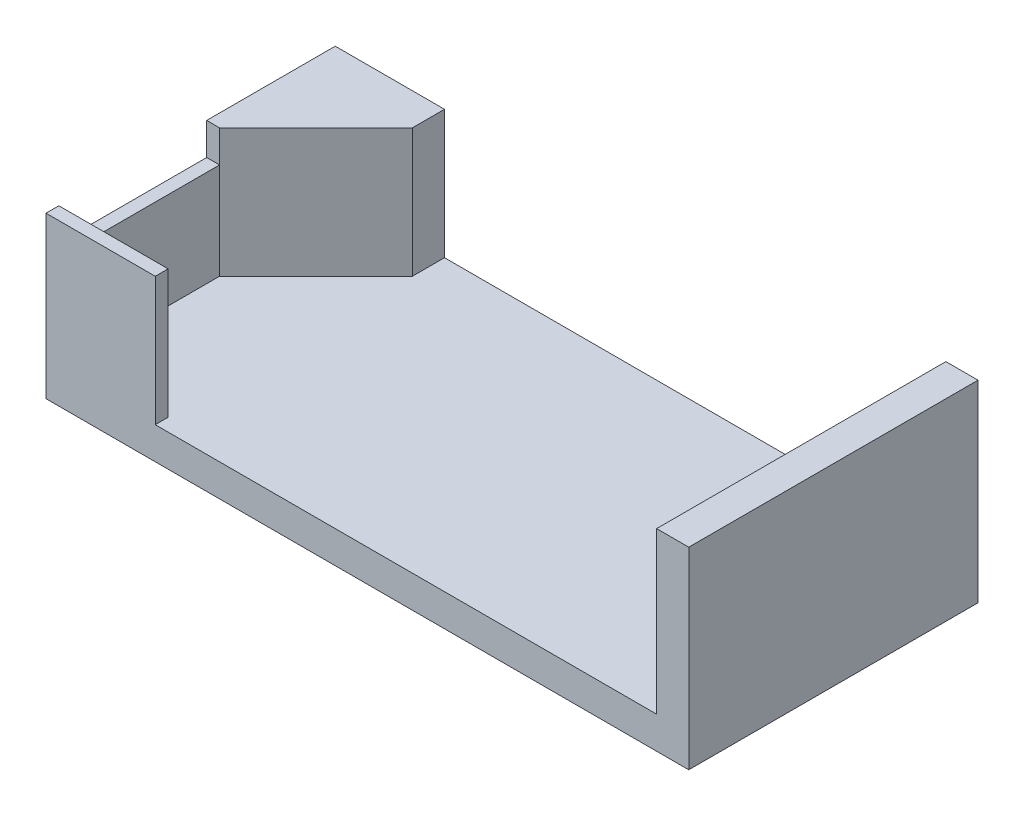
ISO-10303-21;
HEADER;
FILE_DESCRIPTION(('STEP AP214'),'2;1');
FILE_NAME('part.step','',(''),(''),'','','');
FILE_SCHEMA(('AUTOMOTIVE_DESIGN { 1 0 10303 214 1 1 1 1 }'));
ENDSEC;
DATA;
#1=APPLICATION_CONTEXT('core data for automotive mechanical design processes');
#2=APPLICATION_PROTOCOL_DEFINITION('international standard','automotive_design',2000,#1);
#3=PRODUCT_CONTEXT('',#1,'mechanical');
#4=PRODUCT('Part','Part','',(#3));
#5=PRODUCT_RELATED_PRODUCT_CATEGORY('part','',(#4));
#6=PRODUCT_DEFINITION_FORMATION('','',#4);
#7=PRODUCT_DEFINITION_CONTEXT('part definition',#1,'design');
#8=PRODUCT_DEFINITION('design','',#6,#7);
#9=PRODUCT_DEFINITION_SHAPE('','',#8);
#10=(LENGTH_UNIT() NAMED_UNIT(*) SI_UNIT(.MILLI.,.METRE.));
#11=(NAMED_UNIT(*) PLANE_ANGLE_UNIT() SI_UNIT($,.RADIAN.));
#12=(NAMED_UNIT(*) SI_UNIT($,.STERADIAN.) SOLID_ANGLE_UNIT());
#13=UNCERTAINTY_MEASURE_WITH_UNIT(LENGTH_MEASURE(1.E-05),#10,'distance_accuracy_value','');
#14=(GEOMETRIC_REPRESENTATION_CONTEXT(3) GLOBAL_UNCERTAINTY_ASSIGNED_CONTEXT((#13)) GLOBAL_UNIT_ASSIGNED_CONTEXT((#10,
#11,#12)) REPRESENTATION_CONTEXT('',''));
#15=CARTESIAN_POINT('',(0.,0.,0.));
#16=DIRECTION('',(0.,0.,1.));
#17=DIRECTION('',(1.,0.,0.));
#18=AXIS2_PLACEMENT_3D('',#15,#16,#17);
#19=CARTESIAN_POINT('',(0.,0.,0.));
#20=DIRECTION('',(0.,1.,0.));
#21=DIRECTION('',(0.,0.,1.));
#22=AXIS2_PLACEMENT_3D('',#19,#20,#21);
#23=PLANE('',#22);
#24=DIRECTION('',(0.707106781186549,0.,-0.707106781186546));
#25=VECTOR('',#24,1.);
#26=CARTESIAN_POINT('',(-25.25,0.,-25.25));
#27=LINE('',#26,#25);
#28=CARTESIAN_POINT('',(-48.,0.,-2.50000000000007));
#29=VERTEX_POINT('',#28);
#30=CARTESIAN_POINT('',(-33.,0.,-17.5));
#31=VERTEX_POINT('',#30);
#32=EDGE_CURVE('E160',#29,#31,#27,.T.);
#33=ORIENTED_EDGE('',*,*,#32,.F.);
#34=DIRECTION('',(0.,0.,-1.));
#35=VECTOR('',#34,1.);
#36=CARTESIAN_POINT('',(-48.,0.,0.));
#37=LINE('',#36,#35);
#38=CARTESIAN_POINT('',(-48.,0.,20.5));
#39=VERTEX_POINT('',#38);
#40=EDGE_CURVE('E151',#39,#29,#37,.T.);
#41=ORIENTED_EDGE('',*,*,#40,.F.);
#42=DIRECTION('',(1.,0.,0.));
#43=VECTOR('',#42,1.);
#44=CARTESIAN_POINT('',(0.,0.,20.5));
#45=LINE('',#44,#43);
#46=CARTESIAN_POINT('',(-33.,0.,20.5));
#47=VERTEX_POINT('',#46);
#48=EDGE_CURVE('E180',#39,#47,#45,.T.);
#49=ORIENTED_EDGE('',*,*,#48,.T.);
#50=DIRECTION('',(0.,0.,1.));
#51=VECTOR('',#50,1.);
#52=CARTESIAN_POINT('',(-33.,0.,0.));
#53=LINE('',#52,#51);
#54=CARTESIAN_POINT('',(-33.,0.,22.5));
#55=VERTEX_POINT('',#54);
#56=EDGE_CURVE('E176',#47,#55,#53,.T.);
#57=ORIENTED_EDGE('',*,*,#56,.T.);
#58=DIRECTION('',(1.,0.,0.));
#59=VECTOR('',#58,1.);
#60=CARTESIAN_POINT('',(0.,0.,22.5));
#61=LINE('',#60,#59);
#62=CARTESIAN_POINT('',(45.,0.,22.5));
#63=VERTEX_POINT('',#62);
#64=EDGE_CURVE('E230',#55,#63,#61,.T.);
#65=ORIENTED_EDGE('',*,*,#64,.T.);
#66=DIRECTION('',(0.,0.,-1.));
#67=VECTOR('',#66,1.);
#68=CARTESIAN_POINT('',(45.,0.,0.));
#69=LINE('',#68,#67);
#70=CARTESIAN_POINT('',(45.,0.,-22.5));
#71=VERTEX_POINT('',#70);
#72=EDGE_CURVE('E206',#63,#71,#69,.T.);
#73=ORIENTED_EDGE('',*,*,#72,.T.);
#74=DIRECTION('',(1.,0.,0.));
#75=VECTOR('',#74,1.);
#76=CARTESIAN_POINT('',(0.,0.,-22.5));
#77=LINE('',#76,#75);
#78=CARTESIAN_POINT('',(-33.,0.,-22.5));
#79=VERTEX_POINT('',#78);
#80=EDGE_CURVE('E59',#79,#71,#77,.T.);
#81=ORIENTED_EDGE('',*,*,#80,.F.);
#82=DIRECTION('',(0.,0.,-1.));
#83=VECTOR('',#82,1.);
#84=CARTESIAN_POINT('',(-33.,0.,0.));
#85=LINE('',#84,#83);
#86=EDGE_CURVE('E52',#31,#79,#85,.T.);
#87=ORIENTED_EDGE('',*,*,#86,.F.);
#88=EDGE_LOOP('',(#33,#41,#49,#57,#65,#73,#81,#87));
#89=FACE_BOUND('',#88,.T.);
#90=ADVANCED_FACE('F35',(#89),#23,.T.);
#91=CARTESIAN_POINT('',(0.,20.,20.5));
#92=DIRECTION('',(0.,0.,-1.));
#93=DIRECTION('',(-1.,0.,0.));
#94=AXIS2_PLACEMENT_3D('',#91,#92,#93);
#95=PLANE('',#94);
#96=ORIENTED_EDGE('',*,*,#48,.F.);
#97=DIRECTION('',(0.,-1.,0.));
#98=VECTOR('',#97,1.);
#99=CARTESIAN_POINT('',(-48.,15.,20.5));
#100=LINE('',#99,#98);
#101=CARTESIAN_POINT('',(-48.,15.,20.5));
#102=VERTEX_POINT('',#101);
#103=EDGE_CURVE('E161',#102,#39,#100,.T.);
#104=ORIENTED_EDGE('',*,*,#103,.F.);
#105=DIRECTION('',(-1.,0.,0.));
#106=VECTOR('',#105,1.);
#107=CARTESIAN_POINT('',(0.,15.,20.5));
#108=LINE('',#107,#106);
#109=CARTESIAN_POINT('',(-50.,15.,20.5));
#110=VERTEX_POINT('',#109);
#111=EDGE_CURVE('E148',#102,#110,#108,.T.);
#112=ORIENTED_EDGE('',*,*,#111,.T.);
#113=DIRECTION('',(0.,-1.,0.));
#114=VECTOR('',#113,1.);
#115=CARTESIAN_POINT('',(-50.,20.,20.5));
#116=LINE('',#115,#114);
#117=CARTESIAN_POINT('',(-50.,20.,20.5));
#118=VERTEX_POINT('',#117);
#119=EDGE_CURVE('E200',#118,#110,#116,.T.);
#120=ORIENTED_EDGE('',*,*,#119,.F.);
#121=DIRECTION('',(1.,0.,0.));
#122=VECTOR('',#121,1.);
#123=CARTESIAN_POINT('',(0.,20.,20.5));
#124=LINE('',#123,#122);
#125=CARTESIAN_POINT('',(-33.,20.,20.5));
#126=VERTEX_POINT('',#125);
#127=EDGE_CURVE('E189',#118,#126,#124,.T.);
#128=ORIENTED_EDGE('',*,*,#127,.T.);
#129=DIRECTION('',(0.,-1.,0.));
#130=VECTOR('',#129,1.);
#131=CARTESIAN_POINT('',(-33.,20.,20.5));
#132=LINE('',#131,#130);
#133=EDGE_CURVE('E203',#126,#47,#132,.T.);
#134=ORIENTED_EDGE('',*,*,#133,.T.);
#135=EDGE_LOOP('',(#96,#104,#112,#120,#128,#134));
#136=FACE_BOUND('',#135,.T.);
#137=ADVANCED_FACE('F293',(#136),#95,.T.);
#138=CARTESIAN_POINT('',(50.,-5.,0.));
#139=DIRECTION('',(1.,0.,0.));
#140=DIRECTION('',(0.,0.,-1.));
#141=AXIS2_PLACEMENT_3D('',#138,#139,#140);
#142=PLANE('',#141);
#143=DIRECTION('',(0.,1.,0.));
#144=VECTOR('',#143,1.);
#145=CARTESIAN_POINT('',(50.,-5.,-22.5));
#146=LINE('',#145,#144);
#147=CARTESIAN_POINT('',(50.,-5.,-22.5));
#148=VERTEX_POINT('',#147);
#149=CARTESIAN_POINT('',(50.,25.,-22.5));
#150=VERTEX_POINT('',#149);
#151=EDGE_CURVE('E39',#148,#150,#146,.T.);
#152=ORIENTED_EDGE('',*,*,#151,.T.);
#153=DIRECTION('',(0.,0.,-1.));
#154=VECTOR('',#153,1.);
#155=CARTESIAN_POINT('',(50.,25.,0.));
#156=LINE('',#155,#154);
#157=CARTESIAN_POINT('',(50.,25.,22.5));
#158=VERTEX_POINT('',#157);
#159=EDGE_CURVE('E213',#158,#150,#156,.T.);
#160=ORIENTED_EDGE('',*,*,#159,.F.);
#161=DIRECTION('',(0.,1.,0.));
#162=VECTOR('',#161,1.);
#163=CARTESIAN_POINT('',(50.,-5.,22.5));
#164=LINE('',#163,#162);
#165=CARTESIAN_POINT('',(50.,-5.,22.5));
#166=VERTEX_POINT('',#165);
#167=EDGE_CURVE('E11',#166,#158,#164,.T.);
#168=ORIENTED_EDGE('',*,*,#167,.F.);
#169=DIRECTION('',(0.,0.,-1.));
#170=VECTOR('',#169,1.);
#171=CARTESIAN_POINT('',(50.,-5.,0.));
#172=LINE('',#171,#170);
#173=EDGE_CURVE('E226',#166,#148,#172,.T.);
#174=ORIENTED_EDGE('',*,*,#173,.T.);
#175=EDGE_LOOP('',(#152,#160,#168,#174));
#176=FACE_BOUND('',#175,.T.);
#177=ADVANCED_FACE('F37',(#176),#142,.T.);
#178=CARTESIAN_POINT('',(0.,-5.,22.5));
#179=DIRECTION('',(0.,0.,1.));
#180=DIRECTION('',(1.,0.,0.));
#181=AXIS2_PLACEMENT_3D('',#178,#179,#180);
#182=PLANE('',#181);
#183=ORIENTED_EDGE('',*,*,#64,.F.);
#184=DIRECTION('',(0.,-1.,0.));
#185=VECTOR('',#184,1.);
#186=CARTESIAN_POINT('',(-33.,20.,22.5));
#187=LINE('',#186,#185);
#188=CARTESIAN_POINT('',(-33.,20.,22.5));
#189=VERTEX_POINT('',#188);
#190=EDGE_CURVE('E196',#189,#55,#187,.T.);
#191=ORIENTED_EDGE('',*,*,#190,.F.);
#192=DIRECTION('',(1.,0.,0.));
#193=VECTOR('',#192,1.);
#194=CARTESIAN_POINT('',(0.,20.,22.5));
#195=LINE('',#194,#193);
#196=CARTESIAN_POINT('',(-50.,20.,22.5));
#197=VERTEX_POINT('',#196);
#198=EDGE_CURVE('E195',#197,#189,#195,.T.);
#199=ORIENTED_EDGE('',*,*,#198,.F.);
#200=DIRECTION('',(0.,1.,0.));
#201=VECTOR('',#200,1.);
#202=CARTESIAN_POINT('',(-50.,-5.,22.5));
#203=LINE('',#202,#201);
#204=CARTESIAN_POINT('',(-50.,-5.,22.5));
#205=VERTEX_POINT('',#204);
#206=EDGE_CURVE('E44',#205,#197,#203,.T.);
#207=ORIENTED_EDGE('',*,*,#206,.F.);
#208=DIRECTION('',(1.,0.,0.));
#209=VECTOR('',#208,1.);
#210=CARTESIAN_POINT('',(0.,-5.,22.5));
#211=LINE('',#210,#209);
#212=EDGE_CURVE('E234',#205,#166,#211,.T.);
#213=ORIENTED_EDGE('',*,*,#212,.T.);
#214=ORIENTED_EDGE('',*,*,#167,.T.);
#215=DIRECTION('',(1.,0.,0.));
#216=VECTOR('',#215,1.);
#217=CARTESIAN_POINT('',(0.,25.,22.5));
#218=LINE('',#217,#216);
#219=CARTESIAN_POINT('',(45.,25.,22.5));
#220=VERTEX_POINT('',#219);
#221=EDGE_CURVE('E210',#220,#158,#218,.T.);
#222=ORIENTED_EDGE('',*,*,#221,.F.);
#223=DIRECTION('',(0.,-1.,0.));
#224=VECTOR('',#223,1.);
#225=CARTESIAN_POINT('',(45.,25.,22.5));
#226=LINE('',#225,#224);
#227=EDGE_CURVE('E223',#220,#63,#226,.T.);
#228=ORIENTED_EDGE('',*,*,#227,.T.);
#229=EDGE_LOOP('',(#183,#191,#199,#207,#213,#214,#222,#228));
#230=FACE_BOUND('',#229,.T.);
#231=ADVANCED_FACE('F259',(#230),#182,.T.);
#232=CARTESIAN_POINT('',(-50.,-5.,0.));
#233=DIRECTION('',(1.,0.,0.));
#234=DIRECTION('',(0.,0.,-1.));
#235=AXIS2_PLACEMENT_3D('',#232,#233,#234);
#236=PLANE('',#235);
#237=ORIENTED_EDGE('',*,*,#206,.T.);
#238=DIRECTION('',(0.,0.,-1.));
#239=VECTOR('',#238,1.);
#240=CARTESIAN_POINT('',(-50.,20.,0.));
#241=LINE('',#240,#239);
#242=EDGE_CURVE('E192',#197,#118,#241,.T.);
#243=ORIENTED_EDGE('',*,*,#242,.T.);
#244=ORIENTED_EDGE('',*,*,#119,.T.);
#245=DIRECTION('',(0.,0.,-1.));
#246=VECTOR('',#245,1.);
#247=CARTESIAN_POINT('',(-50.,15.,0.));
#248=LINE('',#247,#246);
#249=CARTESIAN_POINT('',(-50.,15.,-2.50000000000007));
#250=VERTEX_POINT('',#249);
#251=EDGE_CURVE('E170',#110,#250,#248,.T.);
#252=ORIENTED_EDGE('',*,*,#251,.T.);
#253=DIRECTION('',(0.,-1.,0.));
#254=VECTOR('',#253,1.);
#255=CARTESIAN_POINT('',(-50.,20.,-2.50000000000007));
#256=LINE('',#255,#254);
#257=CARTESIAN_POINT('',(-50.,20.,-2.50000000000007));
#258=VERTEX_POINT('',#257);
#259=EDGE_CURVE('E169',#258,#250,#256,.T.);
#260=ORIENTED_EDGE('',*,*,#259,.F.);
#261=DIRECTION('',(0.,0.,-1.));
#262=VECTOR('',#261,1.);
#263=CARTESIAN_POINT('',(-50.,20.,0.));
#264=LINE('',#263,#262);
#265=CARTESIAN_POINT('',(-50.,20.,-22.5));
#266=VERTEX_POINT('',#265);
#267=EDGE_CURVE('E268',#258,#266,#264,.T.);
#268=ORIENTED_EDGE('',*,*,#267,.T.);
#269=DIRECTION('',(0.,1.,0.));
#270=VECTOR('',#269,1.);
#271=CARTESIAN_POINT('',(-50.,-5.,-22.5));
#272=LINE('',#271,#270);
#273=CARTESIAN_POINT('',(-50.,-5.,-22.5));
#274=VERTEX_POINT('',#273);
#275=EDGE_CURVE('E239',#274,#266,#272,.T.);
#276=ORIENTED_EDGE('',*,*,#275,.F.);
#277=DIRECTION('',(0.,0.,-1.));
#278=VECTOR('',#277,1.);
#279=CARTESIAN_POINT('',(-50.,-5.,0.));
#280=LINE('',#279,#278);
#281=EDGE_CURVE('E232',#205,#274,#280,.T.);
#282=ORIENTED_EDGE('',*,*,#281,.F.);
#283=EDGE_LOOP('',(#237,#243,#244,#252,#260,#268,#276,#282));
#284=FACE_BOUND('',#283,.T.);
#285=ADVANCED_FACE('F266',(#284),#236,.F.);
#286=CARTESIAN_POINT('',(0.,-5.,-22.5));
#287=DIRECTION('',(0.,0.,1.));
#288=DIRECTION('',(1.,0.,0.));
#289=AXIS2_PLACEMENT_3D('',#286,#287,#288);
#290=PLANE('',#289);
#291=ORIENTED_EDGE('',*,*,#275,.T.);
#292=DIRECTION('',(1.,0.,0.));
#293=VECTOR('',#292,1.);
#294=CARTESIAN_POINT('',(0.,20.,-22.5));
#295=LINE('',#294,#293);
#296=CARTESIAN_POINT('',(-33.,20.,-22.5));
#297=VERTEX_POINT('',#296);
#298=EDGE_CURVE('E270',#266,#297,#295,.T.);
#299=ORIENTED_EDGE('',*,*,#298,.T.);
#300=DIRECTION('',(0.,-1.,0.));
#301=VECTOR('',#300,1.);
#302=CARTESIAN_POINT('',(-33.,20.,-22.5));
#303=LINE('',#302,#301);
#304=EDGE_CURVE('E182',#297,#79,#303,.T.);
#305=ORIENTED_EDGE('',*,*,#304,.T.);
#306=ORIENTED_EDGE('',*,*,#80,.T.);
#307=DIRECTION('',(0.,-1.,0.));
#308=VECTOR('',#307,1.);
#309=CARTESIAN_POINT('',(45.,25.,-22.5));
#310=LINE('',#309,#308);
#311=CARTESIAN_POINT('',(45.,25.,-22.5));
#312=VERTEX_POINT('',#311);
#313=EDGE_CURVE('E219',#312,#71,#310,.T.);
#314=ORIENTED_EDGE('',*,*,#313,.F.);
#315=DIRECTION('',(1.,0.,0.));
#316=VECTOR('',#315,1.);
#317=CARTESIAN_POINT('',(0.,25.,-22.5));
#318=LINE('',#317,#316);
#319=EDGE_CURVE('E216',#312,#150,#318,.T.);
#320=ORIENTED_EDGE('',*,*,#319,.T.);
#321=ORIENTED_EDGE('',*,*,#151,.F.);
#322=DIRECTION('',(1.,0.,0.));
#323=VECTOR('',#322,1.);
#324=CARTESIAN_POINT('',(0.,-5.,-22.5));
#325=LINE('',#324,#323);
#326=EDGE_CURVE('E229',#274,#148,#325,.T.);
#327=ORIENTED_EDGE('',*,*,#326,.F.);
#328=EDGE_LOOP('',(#291,#299,#305,#306,#314,#320,#321,#327));
#329=FACE_BOUND('',#328,.T.);
#330=ADVANCED_FACE('F253',(#329),#290,.F.);
#331=CARTESIAN_POINT('',(0.,-5.,0.));
#332=DIRECTION('',(0.,1.,0.));
#333=DIRECTION('',(0.,0.,1.));
#334=AXIS2_PLACEMENT_3D('',#331,#332,#333);
#335=PLANE('',#334);
#336=ORIENTED_EDGE('',*,*,#173,.F.);
#337=ORIENTED_EDGE('',*,*,#212,.F.);
#338=ORIENTED_EDGE('',*,*,#281,.T.);
#339=ORIENTED_EDGE('',*,*,#326,.T.);
#340=EDGE_LOOP('',(#336,#337,#338,#339));
#341=FACE_BOUND('',#340,.T.);
#342=ADVANCED_FACE('F262',(#341),#335,.F.);
#343=CARTESIAN_POINT('',(45.,25.,0.));
#344=DIRECTION('',(-1.,0.,0.));
#345=DIRECTION('',(0.,0.,1.));
#346=AXIS2_PLACEMENT_3D('',#343,#344,#345);
#347=PLANE('',#346);
#348=ORIENTED_EDGE('',*,*,#72,.F.);
#349=ORIENTED_EDGE('',*,*,#227,.F.);
#350=DIRECTION('',(0.,0.,-1.));
#351=VECTOR('',#350,1.);
#352=CARTESIAN_POINT('',(45.,25.,0.));
#353=LINE('',#352,#351);
#354=EDGE_CURVE('E207',#220,#312,#353,.T.);
#355=ORIENTED_EDGE('',*,*,#354,.T.);
#356=ORIENTED_EDGE('',*,*,#313,.T.);
#357=EDGE_LOOP('',(#348,#349,#355,#356));
#358=FACE_BOUND('',#357,.T.);
#359=ADVANCED_FACE('F256',(#358),#347,.T.);
#360=CARTESIAN_POINT('',(0.,25.,0.));
#361=DIRECTION('',(0.,1.,0.));
#362=DIRECTION('',(0.,0.,1.));
#363=AXIS2_PLACEMENT_3D('',#360,#361,#362);
#364=PLANE('',#363);
#365=ORIENTED_EDGE('',*,*,#354,.F.);
#366=ORIENTED_EDGE('',*,*,#221,.T.);
#367=ORIENTED_EDGE('',*,*,#159,.T.);
#368=ORIENTED_EDGE('',*,*,#319,.F.);
#369=EDGE_LOOP('',(#365,#366,#367,#368));
#370=FACE_BOUND('',#369,.T.);
#371=ADVANCED_FACE('F251',(#370),#364,.T.);
#372=CARTESIAN_POINT('',(-33.,20.,0.));
#373=DIRECTION('',(1.,0.,0.));
#374=DIRECTION('',(0.,0.,-1.));
#375=AXIS2_PLACEMENT_3D('',#372,#373,#374);
#376=PLANE('',#375);
#377=ORIENTED_EDGE('',*,*,#56,.F.);
#378=ORIENTED_EDGE('',*,*,#133,.F.);
#379=DIRECTION('',(0.,0.,1.));
#380=VECTOR('',#379,1.);
#381=CARTESIAN_POINT('',(-33.,20.,0.));
#382=LINE('',#381,#380);
#383=EDGE_CURVE('E186',#126,#189,#382,.T.);
#384=ORIENTED_EDGE('',*,*,#383,.T.);
#385=ORIENTED_EDGE('',*,*,#190,.T.);
#386=EDGE_LOOP('',(#377,#378,#384,#385));
#387=FACE_BOUND('',#386,.T.);
#388=ADVANCED_FACE('F287',(#387),#376,.T.);
#389=CARTESIAN_POINT('',(0.,20.,0.));
#390=DIRECTION('',(0.,1.,0.));
#391=DIRECTION('',(0.,0.,1.));
#392=AXIS2_PLACEMENT_3D('',#389,#390,#391);
#393=PLANE('',#392);
#394=ORIENTED_EDGE('',*,*,#383,.F.);
#395=ORIENTED_EDGE('',*,*,#127,.F.);
#396=ORIENTED_EDGE('',*,*,#242,.F.);
#397=ORIENTED_EDGE('',*,*,#198,.T.);
#398=EDGE_LOOP('',(#394,#395,#396,#397));
#399=FACE_BOUND('',#398,.T.);
#400=ADVANCED_FACE('F290',(#399),#393,.T.);
#401=CARTESIAN_POINT('',(0.,20.,-2.50000000000011));
#402=DIRECTION('',(0.,0.,1.));
#403=DIRECTION('',(1.,0.,0.));
#404=AXIS2_PLACEMENT_3D('',#401,#402,#403);
#405=PLANE('',#404);
#406=DIRECTION('',(-1.,0.,0.));
#407=VECTOR('',#406,1.);
#408=CARTESIAN_POINT('',(0.,15.,-2.50000000000011));
#409=LINE('',#408,#407);
#410=CARTESIAN_POINT('',(-48.,15.,-2.50000000000007));
#411=VERTEX_POINT('',#410);
#412=EDGE_CURVE('E145',#411,#250,#409,.T.);
#413=ORIENTED_EDGE('',*,*,#412,.F.);
#414=DIRECTION('',(0.,-1.,0.));
#415=VECTOR('',#414,1.);
#416=CARTESIAN_POINT('',(-48.,20.,-2.50000000000007));
#417=LINE('',#416,#415);
#418=CARTESIAN_POINT('',(-48.,20.,-2.50000000000007));
#419=VERTEX_POINT('',#418);
#420=EDGE_CURVE('E167',#419,#411,#417,.T.);
#421=ORIENTED_EDGE('',*,*,#420,.F.);
#422=DIRECTION('',(-1.,0.,0.));
#423=VECTOR('',#422,1.);
#424=CARTESIAN_POINT('',(0.,20.,-2.50000000000011));
#425=LINE('',#424,#423);
#426=EDGE_CURVE('E278',#419,#258,#425,.T.);
#427=ORIENTED_EDGE('',*,*,#426,.T.);
#428=ORIENTED_EDGE('',*,*,#259,.T.);
#429=EDGE_LOOP('',(#413,#421,#427,#428));
#430=FACE_BOUND('',#429,.T.);
#431=ADVANCED_FACE('F165',(#430),#405,.T.);
#432=CARTESIAN_POINT('',(-25.25,20.,-25.25));
#433=DIRECTION('',(-0.707106781186546,0.,-0.707106781186549));
#434=DIRECTION('',(-0.707106781186549,0.,0.707106781186546));
#435=AXIS2_PLACEMENT_3D('',#432,#433,#434);
#436=PLANE('',#435);
#437=ORIENTED_EDGE('',*,*,#32,.T.);
#438=DIRECTION('',(0.,-1.,0.));
#439=VECTOR('',#438,1.);
#440=CARTESIAN_POINT('',(-33.,20.,-17.5));
#441=LINE('',#440,#439);
#442=CARTESIAN_POINT('',(-33.,20.,-17.5));
#443=VERTEX_POINT('',#442);
#444=EDGE_CURVE('E177',#443,#31,#441,.T.);
#445=ORIENTED_EDGE('',*,*,#444,.F.);
#446=DIRECTION('',(0.707106781186549,0.,-0.707106781186546));
#447=VECTOR('',#446,1.);
#448=CARTESIAN_POINT('',(-25.25,20.,-25.25));
#449=LINE('',#448,#447);
#450=EDGE_CURVE('E174',#419,#443,#449,.T.);
#451=ORIENTED_EDGE('',*,*,#450,.F.);
#452=ORIENTED_EDGE('',*,*,#420,.T.);
#453=DIRECTION('',(0.,-1.,0.));
#454=VECTOR('',#453,1.);
#455=CARTESIAN_POINT('',(-48.,15.,-2.50000000000007));
#456=LINE('',#455,#454);
#457=EDGE_CURVE('E154',#411,#29,#456,.T.);
#458=ORIENTED_EDGE('',*,*,#457,.T.);
#459=EDGE_LOOP('',(#437,#445,#451,#452,#458));
#460=FACE_BOUND('',#459,.T.);
#461=ADVANCED_FACE('F172',(#460),#436,.F.);
#462=CARTESIAN_POINT('',(-33.,20.,0.));
#463=DIRECTION('',(-1.,0.,0.));
#464=DIRECTION('',(0.,0.,1.));
#465=AXIS2_PLACEMENT_3D('',#462,#463,#464);
#466=PLANE('',#465);
#467=ORIENTED_EDGE('',*,*,#86,.T.);
#468=ORIENTED_EDGE('',*,*,#304,.F.);
#469=DIRECTION('',(0.,0.,-1.));
#470=VECTOR('',#469,1.);
#471=CARTESIAN_POINT('',(-33.,20.,0.));
#472=LINE('',#471,#470);
#473=EDGE_CURVE('E273',#443,#297,#472,.T.);
#474=ORIENTED_EDGE('',*,*,#473,.F.);
#475=ORIENTED_EDGE('',*,*,#444,.T.);
#476=EDGE_LOOP('',(#467,#468,#474,#475));
#477=FACE_BOUND('',#476,.T.);
#478=ADVANCED_FACE('F301',(#477),#466,.F.);
#479=CARTESIAN_POINT('',(0.,20.,0.));
#480=DIRECTION('',(0.,1.,0.));
#481=DIRECTION('',(0.,0.,1.));
#482=AXIS2_PLACEMENT_3D('',#479,#480,#481);
#483=PLANE('',#482);
#484=ORIENTED_EDGE('',*,*,#426,.F.);
#485=ORIENTED_EDGE('',*,*,#450,.T.);
#486=ORIENTED_EDGE('',*,*,#473,.T.);
#487=ORIENTED_EDGE('',*,*,#298,.F.);
#488=ORIENTED_EDGE('',*,*,#267,.F.);
#489=EDGE_LOOP('',(#484,#485,#486,#487,#488));
#490=FACE_BOUND('',#489,.T.);
#491=ADVANCED_FACE('F300',(#490),#483,.T.);
#492=CARTESIAN_POINT('',(-48.,15.,0.));
#493=DIRECTION('',(-1.,0.,0.));
#494=DIRECTION('',(0.,0.,1.));
#495=AXIS2_PLACEMENT_3D('',#492,#493,#494);
#496=PLANE('',#495);
#497=ORIENTED_EDGE('',*,*,#40,.T.);
#498=ORIENTED_EDGE('',*,*,#457,.F.);
#499=DIRECTION('',(0.,0.,-1.));
#500=VECTOR('',#499,1.);
#501=CARTESIAN_POINT('',(-48.,15.,0.));
#502=LINE('',#501,#500);
#503=EDGE_CURVE('E141',#102,#411,#502,.T.);
#504=ORIENTED_EDGE('',*,*,#503,.F.);
#505=ORIENTED_EDGE('',*,*,#103,.T.);
#506=EDGE_LOOP('',(#497,#498,#504,#505));
#507=FACE_BOUND('',#506,.T.);
#508=ADVANCED_FACE('F155',(#507),#496,.F.);
#509=CARTESIAN_POINT('',(0.,15.,0.));
#510=DIRECTION('',(0.,1.,0.));
#511=DIRECTION('',(0.,0.,1.));
#512=AXIS2_PLACEMENT_3D('',#509,#510,#511);
#513=PLANE('',#512);
#514=ORIENTED_EDGE('',*,*,#503,.T.);
#515=ORIENTED_EDGE('',*,*,#412,.T.);
#516=ORIENTED_EDGE('',*,*,#251,.F.);
#517=ORIENTED_EDGE('',*,*,#111,.F.);
#518=EDGE_LOOP('',(#514,#515,#516,#517));
#519=FACE_BOUND('',#518,.T.);
#520=ADVANCED_FACE('F143',(#519),#513,.T.);
#521=CLOSED_SHELL('',(#90,#137,#177,#231,#285,#330,#342,#359,#371,#388,#400,#431,#461,#478,#491,
#508,#520));
#522=MANIFOLD_SOLID_BREP('B2',#521);
#523=ADVANCED_BREP_SHAPE_REPRESENTATION('',(#18,#522),#14);
#524=SHAPE_DEFINITION_REPRESENTATION(#9,#523);
ENDSEC;
END-ISO-10303-21;
